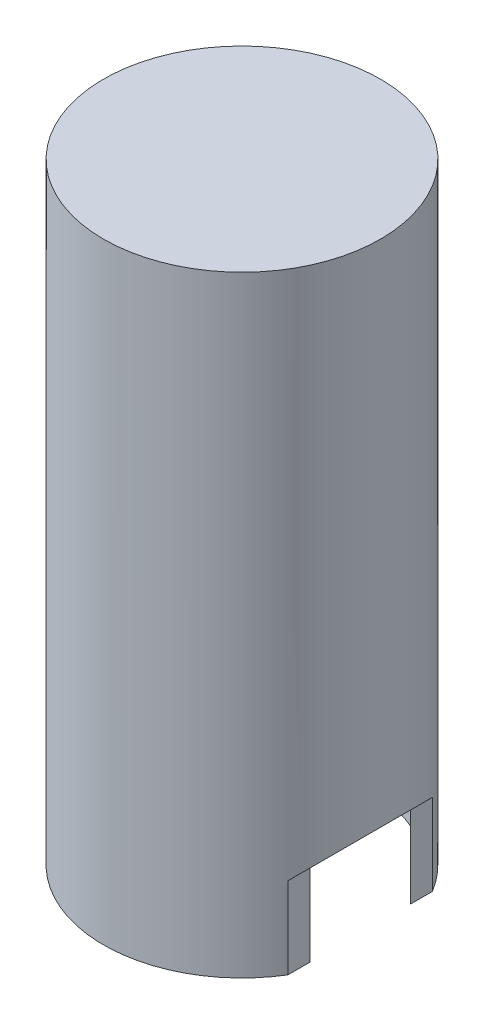
ISO-10303-21;
HEADER;
FILE_DESCRIPTION(('STEP AP214'),'2;1');
FILE_NAME('part.step','',(''),(''),'','','');
FILE_SCHEMA(('AUTOMOTIVE_DESIGN { 1 0 10303 214 1 1 1 1 }'));
ENDSEC;
DATA;
#1=APPLICATION_CONTEXT('core data for automotive mechanical design processes');
#2=APPLICATION_PROTOCOL_DEFINITION('international standard','automotive_design',2000,#1);
#3=PRODUCT_CONTEXT('',#1,'mechanical');
#4=PRODUCT('Part','Part','',(#3));
#5=PRODUCT_RELATED_PRODUCT_CATEGORY('part','',(#4));
#6=PRODUCT_DEFINITION_FORMATION('','',#4);
#7=PRODUCT_DEFINITION_CONTEXT('part definition',#1,'design');
#8=PRODUCT_DEFINITION('design','',#6,#7);
#9=PRODUCT_DEFINITION_SHAPE('','',#8);
#10=(LENGTH_UNIT() NAMED_UNIT(*) SI_UNIT(.MILLI.,.METRE.));
#11=(NAMED_UNIT(*) PLANE_ANGLE_UNIT() SI_UNIT($,.RADIAN.));
#12=(NAMED_UNIT(*) SI_UNIT($,.STERADIAN.) SOLID_ANGLE_UNIT());
#13=UNCERTAINTY_MEASURE_WITH_UNIT(LENGTH_MEASURE(1.E-05),#10,'distance_accuracy_value','');
#14=(GEOMETRIC_REPRESENTATION_CONTEXT(3) GLOBAL_UNCERTAINTY_ASSIGNED_CONTEXT((#13)) GLOBAL_UNIT_ASSIGNED_CONTEXT((#10,
#11,#12)) REPRESENTATION_CONTEXT('',''));
#15=CARTESIAN_POINT('',(0.,0.,0.));
#16=DIRECTION('',(0.,0.,1.));
#17=DIRECTION('',(1.,0.,0.));
#18=AXIS2_PLACEMENT_3D('',#15,#16,#17);
#19=CARTESIAN_POINT('',(0.,0.,0.));
#20=DIRECTION('',(0.,1.,0.));
#21=DIRECTION('',(0.,0.,1.));
#22=AXIS2_PLACEMENT_3D('',#19,#20,#21);
#23=PLANE('',#22);
#24=CARTESIAN_POINT('',(0.,0.,0.));
#25=DIRECTION('',(0.,1.,0.));
#26=DIRECTION('',(0.,0.,1.));
#27=AXIS2_PLACEMENT_3D('',#24,#25,#26);
#28=CIRCLE('',#27,68.);
#29=CARTESIAN_POINT('',(-58.,0.,35.4964786985977));
#30=VERTEX_POINT('',#29);
#31=CARTESIAN_POINT('',(58.,0.,35.4964786985977));
#32=VERTEX_POINT('',#31);
#33=EDGE_CURVE('E142',#30,#32,#28,.T.);
#34=ORIENTED_EDGE('',*,*,#33,.F.);
#35=DIRECTION('',(0.,0.,1.));
#36=VECTOR('',#35,1.);
#37=CARTESIAN_POINT('',(-58.,0.,-68.));
#38=LINE('',#37,#36);
#39=CARTESIAN_POINT('',(-58.,0.,24.5967477524977));
#40=VERTEX_POINT('',#39);
#41=EDGE_CURVE('E122',#40,#30,#38,.T.);
#42=ORIENTED_EDGE('',*,*,#41,.F.);
#43=CARTESIAN_POINT('',(0.,0.,0.));
#44=DIRECTION('',(0.,1.,0.));
#45=DIRECTION('',(0.,0.,1.));
#46=AXIS2_PLACEMENT_3D('',#43,#44,#45);
#47=CIRCLE('',#46,63.);
#48=CARTESIAN_POINT('',(58.,0.,24.5967477524977));
#49=VERTEX_POINT('',#48);
#50=EDGE_CURVE('E138',#40,#49,#47,.T.);
#51=ORIENTED_EDGE('',*,*,#50,.T.);
#52=DIRECTION('',(0.,0.,1.));
#53=VECTOR('',#52,1.);
#54=CARTESIAN_POINT('',(58.,0.,-68.));
#55=LINE('',#54,#53);
#56=EDGE_CURVE('E127',#49,#32,#55,.T.);
#57=ORIENTED_EDGE('',*,*,#56,.T.);
#58=EDGE_LOOP('',(#34,#42,#51,#57));
#59=FACE_BOUND('',#58,.T.);
#60=ADVANCED_FACE('F36',(#59),#23,.F.);
#61=CARTESIAN_POINT('',(0.,300.,0.));
#62=DIRECTION('',(0.,-1.,0.));
#63=DIRECTION('',(0.,0.,-1.));
#64=AXIS2_PLACEMENT_3D('',#61,#62,#63);
#65=CYLINDRICAL_SURFACE('',#64,68.);
#66=CARTESIAN_POINT('',(0.,300.,0.));
#67=DIRECTION('',(0.,1.,0.));
#68=DIRECTION('',(0.,0.,1.));
#69=AXIS2_PLACEMENT_3D('',#66,#67,#68);
#70=CIRCLE('',#69,68.);
#71=CARTESIAN_POINT('',(0.,300.,68.));
#72=VERTEX_POINT('',#71);
#73=EDGE_CURVE('E146',#72,#72,#70,.T.);
#74=ORIENTED_EDGE('',*,*,#73,.F.);
#75=EDGE_LOOP('',(#74));
#76=FACE_BOUND('',#75,.T.);
#77=CARTESIAN_POINT('',(0.,-18.,0.));
#78=DIRECTION('',(0.707106781186547,0.707106781186547,0.));
#79=DIRECTION('',(0.707106781186548,-0.707106781186548,0.));
#80=AXIS2_PLACEMENT_3D('',#77,#78,#79);
#81=ELLIPSE('',#80,96.1665222413705,68.);
#82=CARTESIAN_POINT('',(-58.,40.,-35.4964786985977));
#83=VERTEX_POINT('',#82);
#84=CARTESIAN_POINT('',(-58.,40.,35.4964786985977));
#85=VERTEX_POINT('',#84);
#86=EDGE_CURVE('E136',#83,#85,#81,.T.);
#87=ORIENTED_EDGE('',*,*,#86,.T.);
#88=DIRECTION('',(0.,-1.,0.));
#89=VECTOR('',#88,1.);
#90=CARTESIAN_POINT('',(-58.,300.,35.4964786985977));
#91=LINE('',#90,#89);
#92=EDGE_CURVE('E133',#85,#30,#91,.T.);
#93=ORIENTED_EDGE('',*,*,#92,.T.);
#94=ORIENTED_EDGE('',*,*,#33,.T.);
#95=DIRECTION('',(0.,-1.,0.));
#96=VECTOR('',#95,1.);
#97=CARTESIAN_POINT('',(58.,300.,35.4964786985977));
#98=LINE('',#97,#96);
#99=CARTESIAN_POINT('',(58.,40.,35.4964786985977));
#100=VERTEX_POINT('',#99);
#101=EDGE_CURVE('E106',#32,#100,#98,.F.);
#102=ORIENTED_EDGE('',*,*,#101,.T.);
#103=CARTESIAN_POINT('',(0.,-18.,0.));
#104=DIRECTION('',(-0.707106781186547,0.707106781186547,0.));
#105=DIRECTION('',(-0.707106781186548,-0.707106781186548,0.));
#106=AXIS2_PLACEMENT_3D('',#103,#104,#105);
#107=ELLIPSE('',#106,96.1665222413705,68.);
#108=CARTESIAN_POINT('',(58.,40.,-35.4964786985977));
#109=VERTEX_POINT('',#108);
#110=EDGE_CURVE('E100',#100,#109,#107,.T.);
#111=ORIENTED_EDGE('',*,*,#110,.T.);
#112=DIRECTION('',(0.,-1.,0.));
#113=VECTOR('',#112,1.);
#114=CARTESIAN_POINT('',(58.,300.,-35.4964786985977));
#115=LINE('',#114,#113);
#116=CARTESIAN_POINT('',(58.,0.,-35.4964786985977));
#117=VERTEX_POINT('',#116);
#118=EDGE_CURVE('E103',#109,#117,#115,.T.);
#119=ORIENTED_EDGE('',*,*,#118,.T.);
#120=CARTESIAN_POINT('',(-58.,0.,-35.4964786985977));
#121=VERTEX_POINT('',#120);
#122=EDGE_CURVE('E149',#117,#121,#28,.T.);
#123=ORIENTED_EDGE('',*,*,#122,.T.);
#124=DIRECTION('',(0.,-1.,0.));
#125=VECTOR('',#124,1.);
#126=CARTESIAN_POINT('',(-58.,300.,-35.4964786985977));
#127=LINE('',#126,#125);
#128=EDGE_CURVE('E117',#121,#83,#127,.F.);
#129=ORIENTED_EDGE('',*,*,#128,.T.);
#130=EDGE_LOOP('',(#87,#93,#94,#102,#111,#119,#123,#129));
#131=FACE_BOUND('',#130,.T.);
#132=ADVANCED_FACE('F38',(#76,#131),#65,.T.);
#133=CARTESIAN_POINT('',(0.,300.,0.));
#134=DIRECTION('',(0.,1.,0.));
#135=DIRECTION('',(0.,0.,1.));
#136=AXIS2_PLACEMENT_3D('',#133,#134,#135);
#137=PLANE('',#136);
#138=ORIENTED_EDGE('',*,*,#73,.T.);
#139=EDGE_LOOP('',(#138));
#140=FACE_BOUND('',#139,.T.);
#141=ADVANCED_FACE('F183',(#140),#137,.T.);
#142=CARTESIAN_POINT('',(58.,0.,-24.5967477524977));
#143=VERTEX_POINT('',#142);
#144=CARTESIAN_POINT('',(-58.,0.,-24.5967477524977));
#145=VERTEX_POINT('',#144);
#146=EDGE_CURVE('E143',#143,#145,#47,.T.);
#147=ORIENTED_EDGE('',*,*,#146,.T.);
#148=EDGE_CURVE('E59',#121,#145,#38,.T.);
#149=ORIENTED_EDGE('',*,*,#148,.F.);
#150=ORIENTED_EDGE('',*,*,#122,.F.);
#151=EDGE_CURVE('E116',#117,#143,#55,.T.);
#152=ORIENTED_EDGE('',*,*,#151,.T.);
#153=EDGE_LOOP('',(#147,#149,#150,#152));
#154=FACE_BOUND('',#153,.T.);
#155=ADVANCED_FACE('F181',(#154),#23,.F.);
#156=CARTESIAN_POINT('',(0.,300.,0.));
#157=DIRECTION('',(0.,-1.,0.));
#158=DIRECTION('',(0.,0.,-1.));
#159=AXIS2_PLACEMENT_3D('',#156,#157,#158);
#160=CYLINDRICAL_SURFACE('',#159,63.);
#161=DIRECTION('',(0.,-1.,0.));
#162=VECTOR('',#161,1.);
#163=CARTESIAN_POINT('',(-58.,300.,24.5967477524977));
#164=LINE('',#163,#162);
#165=CARTESIAN_POINT('',(-58.,40.,24.5967477524977));
#166=VERTEX_POINT('',#165);
#167=EDGE_CURVE('E11',#166,#40,#164,.T.);
#168=ORIENTED_EDGE('',*,*,#167,.F.);
#169=CARTESIAN_POINT('',(0.,-18.,0.));
#170=DIRECTION('',(0.707106781186547,0.707106781186547,0.));
#171=DIRECTION('',(0.707106781186548,-0.707106781186548,0.));
#172=AXIS2_PLACEMENT_3D('',#169,#170,#171);
#173=ELLIPSE('',#172,89.095454429505,63.);
#174=CARTESIAN_POINT('',(-58.,40.,-24.5967477524977));
#175=VERTEX_POINT('',#174);
#176=EDGE_CURVE('E44',#175,#166,#173,.T.);
#177=ORIENTED_EDGE('',*,*,#176,.F.);
#178=DIRECTION('',(0.,-1.,0.));
#179=VECTOR('',#178,1.);
#180=CARTESIAN_POINT('',(-58.,300.,-24.5967477524977));
#181=LINE('',#180,#179);
#182=EDGE_CURVE('E156',#145,#175,#181,.F.);
#183=ORIENTED_EDGE('',*,*,#182,.F.);
#184=ORIENTED_EDGE('',*,*,#146,.F.);
#185=DIRECTION('',(0.,-1.,0.));
#186=VECTOR('',#185,1.);
#187=CARTESIAN_POINT('',(58.,300.,-24.5967477524977));
#188=LINE('',#187,#186);
#189=CARTESIAN_POINT('',(58.,40.,-24.5967477524977));
#190=VERTEX_POINT('',#189);
#191=EDGE_CURVE('E154',#190,#143,#188,.T.);
#192=ORIENTED_EDGE('',*,*,#191,.F.);
#193=CARTESIAN_POINT('',(0.,-18.,0.));
#194=DIRECTION('',(-0.707106781186547,0.707106781186547,0.));
#195=DIRECTION('',(-0.707106781186548,-0.707106781186548,0.));
#196=AXIS2_PLACEMENT_3D('',#193,#194,#195);
#197=ELLIPSE('',#196,89.095454429505,63.);
#198=CARTESIAN_POINT('',(58.,40.,24.5967477524976));
#199=VERTEX_POINT('',#198);
#200=EDGE_CURVE('E121',#199,#190,#197,.T.);
#201=ORIENTED_EDGE('',*,*,#200,.F.);
#202=DIRECTION('',(0.,-1.,0.));
#203=VECTOR('',#202,1.);
#204=CARTESIAN_POINT('',(58.,300.,24.5967477524977));
#205=LINE('',#204,#203);
#206=EDGE_CURVE('E152',#49,#199,#205,.F.);
#207=ORIENTED_EDGE('',*,*,#206,.F.);
#208=ORIENTED_EDGE('',*,*,#50,.F.);
#209=EDGE_LOOP('',(#168,#177,#183,#184,#192,#201,#207,#208));
#210=FACE_BOUND('',#209,.T.);
#211=CARTESIAN_POINT('',(0.,295.,0.));
#212=DIRECTION('',(0.,1.,0.));
#213=DIRECTION('',(0.,0.,1.));
#214=AXIS2_PLACEMENT_3D('',#211,#212,#213);
#215=CIRCLE('',#214,63.);
#216=CARTESIAN_POINT('',(0.,295.,63.));
#217=VERTEX_POINT('',#216);
#218=EDGE_CURVE('E139',#217,#217,#215,.T.);
#219=ORIENTED_EDGE('',*,*,#218,.T.);
#220=EDGE_LOOP('',(#219));
#221=FACE_BOUND('',#220,.T.);
#222=ADVANCED_FACE('F172',(#210,#221),#160,.F.);
#223=CARTESIAN_POINT('',(0.,295.,0.));
#224=DIRECTION('',(0.,1.,0.));
#225=DIRECTION('',(0.,0.,1.));
#226=AXIS2_PLACEMENT_3D('',#223,#224,#225);
#227=PLANE('',#226);
#228=ORIENTED_EDGE('',*,*,#218,.F.);
#229=EDGE_LOOP('',(#228));
#230=FACE_BOUND('',#229,.T.);
#231=ADVANCED_FACE('F188',(#230),#227,.F.);
#232=CARTESIAN_POINT('',(58.,0.,-68.));
#233=DIRECTION('',(-1.,0.,0.));
#234=DIRECTION('',(0.,0.,1.));
#235=AXIS2_PLACEMENT_3D('',#232,#233,#234);
#236=PLANE('',#235);
#237=DIRECTION('',(0.,0.,1.));
#238=VECTOR('',#237,1.);
#239=CARTESIAN_POINT('',(58.,40.,-68.));
#240=LINE('',#239,#238);
#241=EDGE_CURVE('E113',#109,#190,#240,.T.);
#242=ORIENTED_EDGE('',*,*,#241,.T.);
#243=ORIENTED_EDGE('',*,*,#191,.T.);
#244=ORIENTED_EDGE('',*,*,#151,.F.);
#245=ORIENTED_EDGE('',*,*,#118,.F.);
#246=EDGE_LOOP('',(#242,#243,#244,#245));
#247=FACE_BOUND('',#246,.T.);
#248=ADVANCED_FACE('F112',(#247),#236,.F.);
#249=ORIENTED_EDGE('',*,*,#56,.F.);
#250=ORIENTED_EDGE('',*,*,#206,.T.);
#251=EDGE_CURVE('E51',#199,#100,#240,.T.);
#252=ORIENTED_EDGE('',*,*,#251,.T.);
#253=ORIENTED_EDGE('',*,*,#101,.F.);
#254=EDGE_LOOP('',(#249,#250,#252,#253));
#255=FACE_BOUND('',#254,.T.);
#256=ADVANCED_FACE('F234',(#255),#236,.F.);
#257=CARTESIAN_POINT('',(58.,40.,-68.));
#258=DIRECTION('',(-0.707106781186547,0.707106781186547,0.));
#259=DIRECTION('',(-0.707106781186548,-0.707106781186548,0.));
#260=AXIS2_PLACEMENT_3D('',#257,#258,#259);
#261=PLANE('',#260);
#262=ORIENTED_EDGE('',*,*,#251,.F.);
#263=ORIENTED_EDGE('',*,*,#200,.T.);
#264=ORIENTED_EDGE('',*,*,#241,.F.);
#265=ORIENTED_EDGE('',*,*,#110,.F.);
#266=EDGE_LOOP('',(#262,#263,#264,#265));
#267=FACE_BOUND('',#266,.T.);
#268=ADVANCED_FACE('F119',(#267),#261,.F.);
#269=CARTESIAN_POINT('',(-58.,40.,-68.));
#270=DIRECTION('',(0.707106781186547,0.707106781186547,0.));
#271=DIRECTION('',(-0.707106781186548,0.707106781186548,0.));
#272=AXIS2_PLACEMENT_3D('',#269,#270,#271);
#273=PLANE('',#272);
#274=DIRECTION('',(0.,0.,1.));
#275=VECTOR('',#274,1.);
#276=CARTESIAN_POINT('',(-58.,40.,-68.));
#277=LINE('',#276,#275);
#278=EDGE_CURVE('E108',#83,#175,#277,.T.);
#279=ORIENTED_EDGE('',*,*,#278,.T.);
#280=ORIENTED_EDGE('',*,*,#176,.T.);
#281=EDGE_CURVE('E163',#166,#85,#277,.T.);
#282=ORIENTED_EDGE('',*,*,#281,.T.);
#283=ORIENTED_EDGE('',*,*,#86,.F.);
#284=EDGE_LOOP('',(#279,#280,#282,#283));
#285=FACE_BOUND('',#284,.T.);
#286=ADVANCED_FACE('F162',(#285),#273,.F.);
#287=CARTESIAN_POINT('',(-58.,0.,-68.));
#288=DIRECTION('',(1.,0.,0.));
#289=DIRECTION('',(0.,0.,-1.));
#290=AXIS2_PLACEMENT_3D('',#287,#288,#289);
#291=PLANE('',#290);
#292=ORIENTED_EDGE('',*,*,#281,.F.);
#293=ORIENTED_EDGE('',*,*,#167,.T.);
#294=ORIENTED_EDGE('',*,*,#41,.T.);
#295=ORIENTED_EDGE('',*,*,#92,.F.);
#296=EDGE_LOOP('',(#292,#293,#294,#295));
#297=FACE_BOUND('',#296,.T.);
#298=ADVANCED_FACE('F169',(#297),#291,.F.);
#299=ORIENTED_EDGE('',*,*,#148,.T.);
#300=ORIENTED_EDGE('',*,*,#182,.T.);
#301=ORIENTED_EDGE('',*,*,#278,.F.);
#302=ORIENTED_EDGE('',*,*,#128,.F.);
#303=EDGE_LOOP('',(#299,#300,#301,#302));
#304=FACE_BOUND('',#303,.T.);
#305=ADVANCED_FACE('F177',(#304),#291,.F.);
#306=CLOSED_SHELL('',(#60,#132,#141,#155,#222,#231,#248,#256,#268,#286,#298,#305));
#307=MANIFOLD_SOLID_BREP('B2',#306);
#308=ADVANCED_BREP_SHAPE_REPRESENTATION('',(#18,#307),#14);
#309=SHAPE_DEFINITION_REPRESENTATION(#9,#308);
ENDSEC;
END-ISO-10303-21;
